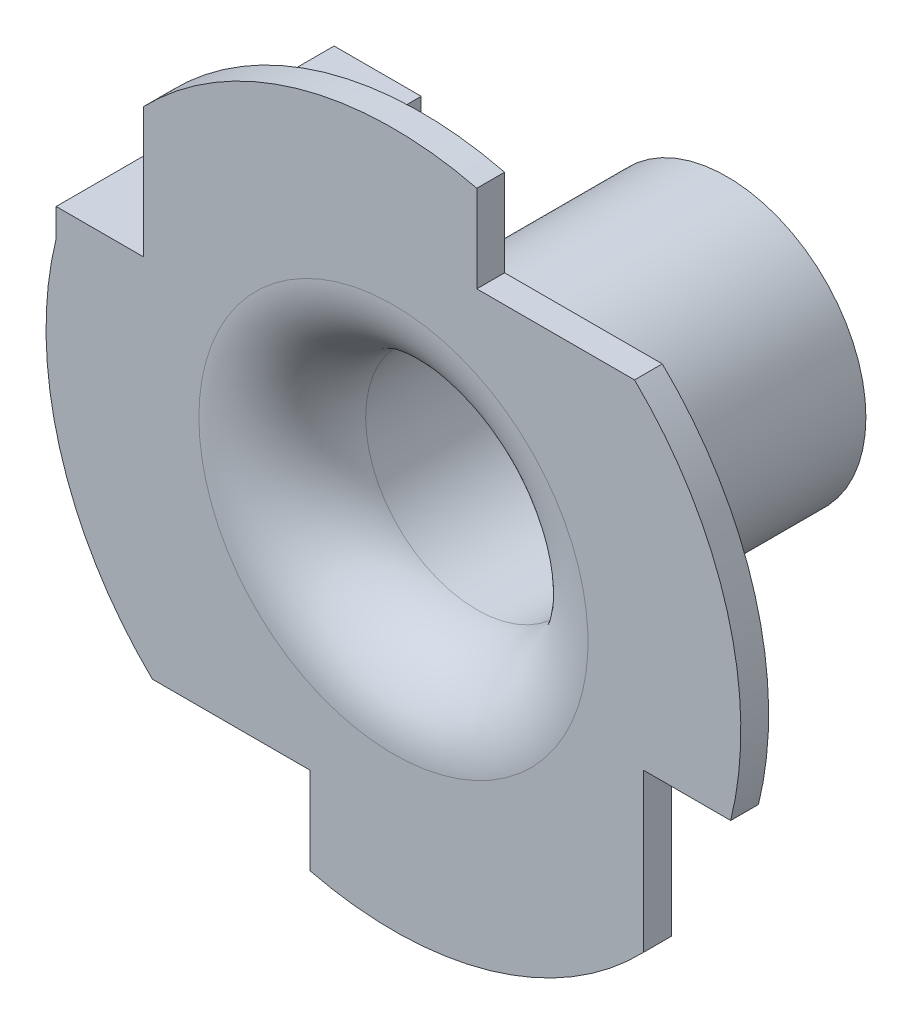
ISO-10303-21;
HEADER;
FILE_DESCRIPTION(('STEP AP214'),'2;1');
FILE_NAME('part.step','',(''),(''),'','','');
FILE_SCHEMA(('AUTOMOTIVE_DESIGN { 1 0 10303 214 1 1 1 1 }'));
ENDSEC;
DATA;
#1=APPLICATION_CONTEXT('core data for automotive mechanical design processes');
#2=APPLICATION_PROTOCOL_DEFINITION('international standard','automotive_design',2000,#1);
#3=PRODUCT_CONTEXT('',#1,'mechanical');
#4=PRODUCT('Part','Part','',(#3));
#5=PRODUCT_RELATED_PRODUCT_CATEGORY('part','',(#4));
#6=PRODUCT_DEFINITION_FORMATION('','',#4);
#7=PRODUCT_DEFINITION_CONTEXT('part definition',#1,'design');
#8=PRODUCT_DEFINITION('design','',#6,#7);
#9=PRODUCT_DEFINITION_SHAPE('','',#8);
#10=(LENGTH_UNIT() NAMED_UNIT(*) SI_UNIT(.MILLI.,.METRE.));
#11=(NAMED_UNIT(*) PLANE_ANGLE_UNIT() SI_UNIT($,.RADIAN.));
#12=(NAMED_UNIT(*) SI_UNIT($,.STERADIAN.) SOLID_ANGLE_UNIT());
#13=UNCERTAINTY_MEASURE_WITH_UNIT(LENGTH_MEASURE(1.E-05),#10,'distance_accuracy_value','');
#14=(GEOMETRIC_REPRESENTATION_CONTEXT(3) GLOBAL_UNCERTAINTY_ASSIGNED_CONTEXT((#13)) GLOBAL_UNIT_ASSIGNED_CONTEXT((#10,
#11,#12)) REPRESENTATION_CONTEXT('',''));
#15=CARTESIAN_POINT('',(0.,0.,0.));
#16=DIRECTION('',(0.,0.,1.));
#17=DIRECTION('',(1.,0.,0.));
#18=AXIS2_PLACEMENT_3D('',#15,#16,#17);
#19=CARTESIAN_POINT('',(-9.,8.67467578644876,10.));
#20=DIRECTION('',(1.,0.,0.));
#21=DIRECTION('',(0.,0.,-1.));
#22=AXIS2_PLACEMENT_3D('',#19,#20,#21);
#23=PLANE('',#22);
#24=DIRECTION('',(0.,0.,-1.));
#25=VECTOR('',#24,1.);
#26=CARTESIAN_POINT('',(-9.,4.,1.));
#27=LINE('',#26,#25);
#28=CARTESIAN_POINT('',(-9.,4.,1.));
#29=VERTEX_POINT('',#28);
#30=CARTESIAN_POINT('',(-9.,4.,0.));
#31=VERTEX_POINT('',#30);
#32=EDGE_CURVE('E71',#29,#31,#27,.T.);
#33=ORIENTED_EDGE('',*,*,#32,.F.);
#34=DIRECTION('',(0.,-1.,0.));
#35=VECTOR('',#34,1.);
#36=CARTESIAN_POINT('',(-9.,0.,1.));
#37=LINE('',#36,#35);
#38=CARTESIAN_POINT('',(-9.,8.67467578644876,0.999999999999999));
#39=VERTEX_POINT('',#38);
#40=EDGE_CURVE('E13',#39,#29,#37,.T.);
#41=ORIENTED_EDGE('',*,*,#40,.F.);
#42=DIRECTION('',(0.,0.,-1.));
#43=VECTOR('',#42,1.);
#44=CARTESIAN_POINT('',(-9.,8.67467578644876,10.));
#45=LINE('',#44,#43);
#46=CARTESIAN_POINT('',(-9.,8.67467578644876,0.));
#47=VERTEX_POINT('',#46);
#48=EDGE_CURVE('E203',#39,#47,#45,.T.);
#49=ORIENTED_EDGE('',*,*,#48,.T.);
#50=DIRECTION('',(0.,-1.,0.));
#51=VECTOR('',#50,1.);
#52=CARTESIAN_POINT('',(-9.,8.67467578644876,0.));
#53=LINE('',#52,#51);
#54=EDGE_CURVE('E196',#47,#31,#53,.T.);
#55=ORIENTED_EDGE('',*,*,#54,.T.);
#56=EDGE_LOOP('',(#33,#41,#49,#55));
#57=FACE_BOUND('',#56,.T.);
#58=ADVANCED_FACE('F51',(#57),#23,.F.);
#59=CARTESIAN_POINT('',(0.,0.,-90.4084027436774));
#60=DIRECTION('',(0.,0.,-1.));
#61=DIRECTION('',(-1.,0.,0.));
#62=AXIS2_PLACEMENT_3D('',#59,#60,#61);
#63=CYLINDRICAL_SURFACE('',#62,12.5);
#64=ORIENTED_EDGE('',*,*,#48,.F.);
#65=CARTESIAN_POINT('',(0.,0.,1.));
#66=DIRECTION('',(0.,0.,-1.));
#67=DIRECTION('',(-1.,0.,0.));
#68=AXIS2_PLACEMENT_3D('',#65,#66,#67);
#69=CIRCLE('',#68,12.5);
#70=CARTESIAN_POINT('',(2.99999999999987,12.1346610995116,0.999999999999999));
#71=VERTEX_POINT('',#70);
#72=EDGE_CURVE('E260',#39,#71,#69,.T.);
#73=ORIENTED_EDGE('',*,*,#72,.T.);
#74=DIRECTION('',(0.,0.,-1.));
#75=VECTOR('',#74,1.);
#76=CARTESIAN_POINT('',(2.99999999999987,12.1346610995116,10.));
#77=LINE('',#76,#75);
#78=CARTESIAN_POINT('',(2.99999999999987,12.1346610995116,0.));
#79=VERTEX_POINT('',#78);
#80=EDGE_CURVE('E193',#71,#79,#77,.T.);
#81=ORIENTED_EDGE('',*,*,#80,.T.);
#82=CARTESIAN_POINT('',(0.,0.,0.));
#83=DIRECTION('',(0.,0.,-1.));
#84=DIRECTION('',(-1.,0.,0.));
#85=AXIS2_PLACEMENT_3D('',#82,#83,#84);
#86=CIRCLE('',#85,12.5);
#87=EDGE_CURVE('E251',#47,#79,#86,.T.);
#88=ORIENTED_EDGE('',*,*,#87,.F.);
#89=EDGE_LOOP('',(#64,#73,#81,#88));
#90=FACE_BOUND('',#89,.T.);
#91=ADVANCED_FACE('F303',(#90),#63,.T.);
#92=CARTESIAN_POINT('',(-8.67467578644872,-9.00000000000003,0.999999999999999));
#93=VERTEX_POINT('',#92);
#94=CARTESIAN_POINT('',(-12.1346610995116,3.,0.999999999999999));
#95=VERTEX_POINT('',#94);
#96=EDGE_CURVE('E255',#93,#95,#69,.T.);
#97=ORIENTED_EDGE('',*,*,#96,.T.);
#98=DIRECTION('',(0.,0.,-1.));
#99=VECTOR('',#98,1.);
#100=CARTESIAN_POINT('',(-12.1346610995116,3.,10.));
#101=LINE('',#100,#99);
#102=CARTESIAN_POINT('',(-12.1346610995116,3.,0.));
#103=VERTEX_POINT('',#102);
#104=EDGE_CURVE('E205',#95,#103,#101,.T.);
#105=ORIENTED_EDGE('',*,*,#104,.T.);
#106=CARTESIAN_POINT('',(-8.67467578644872,-9.00000000000003,0.));
#107=VERTEX_POINT('',#106);
#108=EDGE_CURVE('E248',#107,#103,#86,.T.);
#109=ORIENTED_EDGE('',*,*,#108,.F.);
#110=DIRECTION('',(0.,0.,-1.));
#111=VECTOR('',#110,1.);
#112=CARTESIAN_POINT('',(-8.67467578644872,-9.00000000000003,10.));
#113=LINE('',#112,#111);
#114=EDGE_CURVE('E206',#93,#107,#113,.T.);
#115=ORIENTED_EDGE('',*,*,#114,.F.);
#116=EDGE_LOOP('',(#97,#105,#109,#115));
#117=FACE_BOUND('',#116,.T.);
#118=ADVANCED_FACE('F342',(#117),#63,.T.);
#119=CARTESIAN_POINT('',(9.00000000000006,-8.67467578644869,0.999999999999999));
#120=VERTEX_POINT('',#119);
#121=CARTESIAN_POINT('',(-2.99999999999996,-12.1346610995116,0.999999999999999));
#122=VERTEX_POINT('',#121);
#123=EDGE_CURVE('E258',#120,#122,#69,.T.);
#124=ORIENTED_EDGE('',*,*,#123,.T.);
#125=DIRECTION('',(0.,0.,-1.));
#126=VECTOR('',#125,1.);
#127=CARTESIAN_POINT('',(-2.99999999999996,-12.1346610995116,10.));
#128=LINE('',#127,#126);
#129=CARTESIAN_POINT('',(-2.99999999999996,-12.1346610995116,0.));
#130=VERTEX_POINT('',#129);
#131=EDGE_CURVE('E211',#122,#130,#128,.T.);
#132=ORIENTED_EDGE('',*,*,#131,.T.);
#133=CARTESIAN_POINT('',(9.00000000000006,-8.67467578644869,0.));
#134=VERTEX_POINT('',#133);
#135=EDGE_CURVE('E252',#134,#130,#86,.T.);
#136=ORIENTED_EDGE('',*,*,#135,.F.);
#137=DIRECTION('',(0.,0.,-1.));
#138=VECTOR('',#137,1.);
#139=CARTESIAN_POINT('',(9.00000000000006,-8.67467578644869,10.));
#140=LINE('',#139,#138);
#141=EDGE_CURVE('E218',#120,#134,#140,.T.);
#142=ORIENTED_EDGE('',*,*,#141,.F.);
#143=EDGE_LOOP('',(#124,#132,#136,#142));
#144=FACE_BOUND('',#143,.T.);
#145=ADVANCED_FACE('F295',(#144),#63,.T.);
#146=CARTESIAN_POINT('',(7.00000000000001,0.,0.));
#147=DIRECTION('',(0.,0.,1.));
#148=DIRECTION('',(1.,0.,0.));
#149=AXIS2_PLACEMENT_3D('',#146,#147,#148);
#150=PLANE('',#149);
#151=CARTESIAN_POINT('',(0.,0.,0.));
#152=DIRECTION('',(0.,0.,-1.));
#153=DIRECTION('',(-1.,0.,0.));
#154=AXIS2_PLACEMENT_3D('',#151,#152,#153);
#155=CIRCLE('',#154,7.00000000000001);
#156=CARTESIAN_POINT('',(-7.00000000000001,0.,0.));
#157=VERTEX_POINT('',#156);
#158=EDGE_CURVE('E249',#157,#157,#155,.T.);
#159=ORIENTED_EDGE('',*,*,#158,.F.);
#160=EDGE_LOOP('',(#159));
#161=FACE_BOUND('',#160,.T.);
#162=ORIENTED_EDGE('',*,*,#54,.F.);
#163=ORIENTED_EDGE('',*,*,#87,.T.);
#164=DIRECTION('',(0.,1.,0.));
#165=VECTOR('',#164,1.);
#166=CARTESIAN_POINT('',(2.99999999999991,9.00000000000003,0.));
#167=LINE('',#166,#165);
#168=CARTESIAN_POINT('',(2.99999999999991,9.00000000000003,0.));
#169=VERTEX_POINT('',#168);
#170=EDGE_CURVE('E235',#169,#79,#167,.T.);
#171=ORIENTED_EDGE('',*,*,#170,.F.);
#172=DIRECTION('',(-1.,0.,0.));
#173=VECTOR('',#172,1.);
#174=CARTESIAN_POINT('',(8.67467578644866,9.00000000000009,0.));
#175=LINE('',#174,#173);
#176=CARTESIAN_POINT('',(8.67467578644866,9.00000000000009,0.));
#177=VERTEX_POINT('',#176);
#178=EDGE_CURVE('E230',#177,#169,#175,.T.);
#179=ORIENTED_EDGE('',*,*,#178,.F.);
#180=CARTESIAN_POINT('',(12.1346610995116,-2.99999999999991,0.));
#181=VERTEX_POINT('',#180);
#182=EDGE_CURVE('E316',#177,#181,#86,.T.);
#183=ORIENTED_EDGE('',*,*,#182,.T.);
#184=DIRECTION('',(1.,0.,0.));
#185=VECTOR('',#184,1.);
#186=CARTESIAN_POINT('',(9.00000000000002,-2.99999999999994,0.));
#187=LINE('',#186,#185);
#188=CARTESIAN_POINT('',(9.00000000000002,-2.99999999999994,0.));
#189=VERTEX_POINT('',#188);
#190=EDGE_CURVE('E222',#189,#181,#187,.T.);
#191=ORIENTED_EDGE('',*,*,#190,.F.);
#192=DIRECTION('',(0.,1.,0.));
#193=VECTOR('',#192,1.);
#194=CARTESIAN_POINT('',(9.00000000000006,-8.67467578644869,0.));
#195=LINE('',#194,#193);
#196=EDGE_CURVE('E212',#134,#189,#195,.T.);
#197=ORIENTED_EDGE('',*,*,#196,.F.);
#198=ORIENTED_EDGE('',*,*,#135,.T.);
#199=DIRECTION('',(0.,-1.,0.));
#200=VECTOR('',#199,1.);
#201=CARTESIAN_POINT('',(-2.99999999999997,-9.00000000000001,0.));
#202=LINE('',#201,#200);
#203=CARTESIAN_POINT('',(-2.99999999999997,-9.00000000000001,0.));
#204=VERTEX_POINT('',#203);
#205=EDGE_CURVE('E208',#204,#130,#202,.T.);
#206=ORIENTED_EDGE('',*,*,#205,.F.);
#207=DIRECTION('',(1.,0.,0.));
#208=VECTOR('',#207,1.);
#209=CARTESIAN_POINT('',(-8.67467578644872,-9.00000000000003,0.));
#210=LINE('',#209,#208);
#211=EDGE_CURVE('E216',#107,#204,#210,.T.);
#212=ORIENTED_EDGE('',*,*,#211,.F.);
#213=ORIENTED_EDGE('',*,*,#108,.T.);
#214=DIRECTION('',(-1.,0.,0.));
#215=VECTOR('',#214,1.);
#216=CARTESIAN_POINT('',(-9.,3.,0.));
#217=LINE('',#216,#215);
#218=CARTESIAN_POINT('',(-9.,3.,0.));
#219=VERTEX_POINT('',#218);
#220=EDGE_CURVE('E167',#219,#103,#217,.T.);
#221=ORIENTED_EDGE('',*,*,#220,.F.);
#222=EDGE_CURVE('E69',#31,#219,#53,.T.);
#223=ORIENTED_EDGE('',*,*,#222,.F.);
#224=EDGE_LOOP('',(#162,#163,#171,#179,#183,#191,#197,#198,#206,#212,#213,#221,#223));
#225=FACE_BOUND('',#224,.T.);
#226=ADVANCED_FACE('F311',(#161,#225),#150,.F.);
#227=CARTESIAN_POINT('',(4.00000000000001,0.,-11.));
#228=DIRECTION('',(0.,0.,1.));
#229=DIRECTION('',(1.,0.,0.));
#230=AXIS2_PLACEMENT_3D('',#227,#228,#229);
#231=PLANE('',#230);
#232=CARTESIAN_POINT('',(0.,0.,-11.));
#233=DIRECTION('',(0.,0.,-1.));
#234=DIRECTION('',(-1.,0.,0.));
#235=AXIS2_PLACEMENT_3D('',#232,#233,#234);
#236=CIRCLE('',#235,4.00000000000001);
#237=CARTESIAN_POINT('',(-4.00000000000001,0.,-11.));
#238=VERTEX_POINT('',#237);
#239=EDGE_CURVE('E262',#238,#238,#236,.T.);
#240=ORIENTED_EDGE('',*,*,#239,.F.);
#241=EDGE_LOOP('',(#240));
#242=FACE_BOUND('',#241,.T.);
#243=CARTESIAN_POINT('',(0.,0.,-11.));
#244=DIRECTION('',(0.,0.,-1.));
#245=DIRECTION('',(-1.,0.,0.));
#246=AXIS2_PLACEMENT_3D('',#243,#244,#245);
#247=CIRCLE('',#246,5.00000000000001);
#248=CARTESIAN_POINT('',(-5.00000000000001,0.,-11.));
#249=VERTEX_POINT('',#248);
#250=EDGE_CURVE('E204',#249,#249,#247,.T.);
#251=ORIENTED_EDGE('',*,*,#250,.T.);
#252=EDGE_LOOP('',(#251));
#253=FACE_BOUND('',#252,.T.);
#254=ADVANCED_FACE('F52',(#242,#253),#231,.F.);
#255=CARTESIAN_POINT('',(0.,0.,-90.4084027436774));
#256=DIRECTION('',(0.,0.,-1.));
#257=DIRECTION('',(-1.,0.,0.));
#258=AXIS2_PLACEMENT_3D('',#255,#256,#257);
#259=CYLINDRICAL_SURFACE('',#258,4.00000000000001);
#260=CARTESIAN_POINT('',(0.,0.,-2.));
#261=DIRECTION('',(0.,0.,-1.));
#262=DIRECTION('',(-1.,0.,0.));
#263=AXIS2_PLACEMENT_3D('',#260,#261,#262);
#264=CIRCLE('',#263,4.00000000000001);
#265=CARTESIAN_POINT('',(-4.00000000000001,0.,-2.));
#266=VERTEX_POINT('',#265);
#267=EDGE_CURVE('E261',#266,#266,#264,.T.);
#268=ORIENTED_EDGE('',*,*,#267,.F.);
#269=EDGE_LOOP('',(#268));
#270=FACE_BOUND('',#269,.T.);
#271=ORIENTED_EDGE('',*,*,#239,.T.);
#272=EDGE_LOOP('',(#271));
#273=FACE_BOUND('',#272,.T.);
#274=ADVANCED_FACE('F446',(#270,#273),#259,.F.);
#275=CARTESIAN_POINT('',(0.,0.,-2.));
#276=DIRECTION('',(0.,0.,-1.));
#277=DIRECTION('',(-1.,0.,0.));
#278=AXIS2_PLACEMENT_3D('',#275,#276,#277);
#279=TOROIDAL_SURFACE('',#278,7.00000000000001,3.);
#280=CARTESIAN_POINT('',(0.,0.,1.));
#281=DIRECTION('',(0.,0.,-1.));
#282=DIRECTION('',(-1.,0.,0.));
#283=AXIS2_PLACEMENT_3D('',#280,#281,#282);
#284=CIRCLE('',#283,7.00000000000001);
#285=CARTESIAN_POINT('',(-7.00000000000001,0.,1.));
#286=VERTEX_POINT('',#285);
#287=EDGE_CURVE('E256',#286,#286,#284,.T.);
#288=ORIENTED_EDGE('',*,*,#287,.F.);
#289=EDGE_LOOP('',(#288));
#290=FACE_BOUND('',#289,.T.);
#291=ORIENTED_EDGE('',*,*,#267,.T.);
#292=EDGE_LOOP('',(#291));
#293=FACE_BOUND('',#292,.T.);
#294=ADVANCED_FACE('F387',(#290,#293),#279,.T.);
#295=CARTESIAN_POINT('',(7.00000000000001,0.,1.));
#296=DIRECTION('',(0.,0.,-1.));
#297=DIRECTION('',(-1.,0.,0.));
#298=AXIS2_PLACEMENT_3D('',#295,#296,#297);
#299=PLANE('',#298);
#300=ORIENTED_EDGE('',*,*,#40,.T.);
#301=DIRECTION('',(-1.,0.,0.));
#302=VECTOR('',#301,1.);
#303=CARTESIAN_POINT('',(-9.,4.,1.));
#304=LINE('',#303,#302);
#305=CARTESIAN_POINT('',(-12.1346610995116,4.,1.));
#306=VERTEX_POINT('',#305);
#307=EDGE_CURVE('E168',#29,#306,#304,.T.);
#308=ORIENTED_EDGE('',*,*,#307,.T.);
#309=DIRECTION('',(0.,1.,0.));
#310=VECTOR('',#309,1.);
#311=CARTESIAN_POINT('',(-12.1346610995116,3.,1.));
#312=LINE('',#311,#310);
#313=EDGE_CURVE('E186',#95,#306,#312,.T.);
#314=ORIENTED_EDGE('',*,*,#313,.F.);
#315=ORIENTED_EDGE('',*,*,#96,.F.);
#316=DIRECTION('',(1.,0.,0.));
#317=VECTOR('',#316,1.);
#318=CARTESIAN_POINT('',(7.00000000000004,-8.99999999999998,1.));
#319=LINE('',#318,#317);
#320=CARTESIAN_POINT('',(-2.99999999999997,-9.00000000000001,1.));
#321=VERTEX_POINT('',#320);
#322=EDGE_CURVE('E276',#93,#321,#319,.T.);
#323=ORIENTED_EDGE('',*,*,#322,.T.);
#324=DIRECTION('',(0.,-1.,0.));
#325=VECTOR('',#324,1.);
#326=CARTESIAN_POINT('',(-3.,0.,1.));
#327=LINE('',#326,#325);
#328=EDGE_CURVE('E56',#321,#122,#327,.T.);
#329=ORIENTED_EDGE('',*,*,#328,.T.);
#330=ORIENTED_EDGE('',*,*,#123,.F.);
#331=DIRECTION('',(0.,1.,0.));
#332=VECTOR('',#331,1.);
#333=CARTESIAN_POINT('',(9.,0.,1.));
#334=LINE('',#333,#332);
#335=CARTESIAN_POINT('',(9.00000000000002,-2.99999999999994,1.));
#336=VERTEX_POINT('',#335);
#337=EDGE_CURVE('E272',#120,#336,#334,.T.);
#338=ORIENTED_EDGE('',*,*,#337,.T.);
#339=DIRECTION('',(1.,0.,0.));
#340=VECTOR('',#339,1.);
#341=CARTESIAN_POINT('',(7.00000000000003,-2.99999999999995,1.));
#342=LINE('',#341,#340);
#343=CARTESIAN_POINT('',(12.1346610995116,-2.99999999999991,0.999999999999999));
#344=VERTEX_POINT('',#343);
#345=EDGE_CURVE('E277',#336,#344,#342,.T.);
#346=ORIENTED_EDGE('',*,*,#345,.T.);
#347=CARTESIAN_POINT('',(8.67467578644866,9.00000000000009,0.999999999999999));
#348=VERTEX_POINT('',#347);
#349=EDGE_CURVE('E293',#348,#344,#69,.T.);
#350=ORIENTED_EDGE('',*,*,#349,.F.);
#351=DIRECTION('',(-1.,0.,0.));
#352=VECTOR('',#351,1.);
#353=CARTESIAN_POINT('',(6.99999999999992,9.00000000000007,1.));
#354=LINE('',#353,#352);
#355=CARTESIAN_POINT('',(2.99999999999991,9.00000000000003,1.));
#356=VERTEX_POINT('',#355);
#357=EDGE_CURVE('E270',#348,#356,#354,.T.);
#358=ORIENTED_EDGE('',*,*,#357,.T.);
#359=DIRECTION('',(0.,1.,0.));
#360=VECTOR('',#359,1.);
#361=CARTESIAN_POINT('',(3.,0.,1.));
#362=LINE('',#361,#360);
#363=EDGE_CURVE('E269',#356,#71,#362,.T.);
#364=ORIENTED_EDGE('',*,*,#363,.T.);
#365=ORIENTED_EDGE('',*,*,#72,.F.);
#366=EDGE_LOOP('',(#300,#308,#314,#315,#323,#329,#330,#338,#346,#350,#358,#364,#365));
#367=FACE_BOUND('',#366,.T.);
#368=ORIENTED_EDGE('',*,*,#287,.T.);
#369=EDGE_LOOP('',(#368));
#370=FACE_BOUND('',#369,.T.);
#371=ADVANCED_FACE('F289',(#367,#370),#299,.F.);
#372=ORIENTED_EDGE('',*,*,#349,.T.);
#373=DIRECTION('',(0.,0.,-1.));
#374=VECTOR('',#373,1.);
#375=CARTESIAN_POINT('',(12.1346610995116,-2.99999999999991,10.));
#376=LINE('',#375,#374);
#377=EDGE_CURVE('E221',#344,#181,#376,.T.);
#378=ORIENTED_EDGE('',*,*,#377,.T.);
#379=ORIENTED_EDGE('',*,*,#182,.F.);
#380=DIRECTION('',(0.,0.,-1.));
#381=VECTOR('',#380,1.);
#382=CARTESIAN_POINT('',(8.67467578644866,9.00000000000009,10.));
#383=LINE('',#382,#381);
#384=EDGE_CURVE('E234',#348,#177,#383,.T.);
#385=ORIENTED_EDGE('',*,*,#384,.F.);
#386=EDGE_LOOP('',(#372,#378,#379,#385));
#387=FACE_BOUND('',#386,.T.);
#388=ADVANCED_FACE('F326',(#387),#63,.T.);
#389=CARTESIAN_POINT('',(0.,0.,-2.));
#390=DIRECTION('',(0.,0.,-1.));
#391=DIRECTION('',(-1.,0.,0.));
#392=AXIS2_PLACEMENT_3D('',#389,#390,#391);
#393=TOROIDAL_SURFACE('',#392,7.00000000000001,2.);
#394=CARTESIAN_POINT('',(0.,0.,-2.));
#395=DIRECTION('',(0.,0.,-1.));
#396=DIRECTION('',(-1.,0.,0.));
#397=AXIS2_PLACEMENT_3D('',#394,#395,#396);
#398=CIRCLE('',#397,5.00000000000001);
#399=CARTESIAN_POINT('',(-5.00000000000001,0.,-2.));
#400=VERTEX_POINT('',#399);
#401=EDGE_CURVE('E244',#400,#400,#398,.T.);
#402=ORIENTED_EDGE('',*,*,#401,.F.);
#403=EDGE_LOOP('',(#402));
#404=FACE_BOUND('',#403,.T.);
#405=ORIENTED_EDGE('',*,*,#158,.T.);
#406=EDGE_LOOP('',(#405));
#407=FACE_BOUND('',#406,.T.);
#408=ADVANCED_FACE('F443',(#404,#407),#393,.F.);
#409=CARTESIAN_POINT('',(0.,0.,-90.4084027436774));
#410=DIRECTION('',(0.,0.,-1.));
#411=DIRECTION('',(-1.,0.,0.));
#412=AXIS2_PLACEMENT_3D('',#409,#410,#411);
#413=CYLINDRICAL_SURFACE('',#412,5.00000000000001);
#414=ORIENTED_EDGE('',*,*,#250,.F.);
#415=EDGE_LOOP('',(#414));
#416=FACE_BOUND('',#415,.T.);
#417=ORIENTED_EDGE('',*,*,#401,.T.);
#418=EDGE_LOOP('',(#417));
#419=FACE_BOUND('',#418,.T.);
#420=ADVANCED_FACE('F337',(#416,#419),#413,.T.);
#421=CARTESIAN_POINT('',(2.99999999999991,9.00000000000003,10.));
#422=DIRECTION('',(-1.,0.,0.));
#423=DIRECTION('',(0.,-1.,0.));
#424=AXIS2_PLACEMENT_3D('',#421,#422,#423);
#425=PLANE('',#424);
#426=DIRECTION('',(0.,0.,-1.));
#427=VECTOR('',#426,1.);
#428=CARTESIAN_POINT('',(2.99999999999991,9.00000000000003,10.));
#429=LINE('',#428,#427);
#430=EDGE_CURVE('E233',#356,#169,#429,.T.);
#431=ORIENTED_EDGE('',*,*,#430,.T.);
#432=ORIENTED_EDGE('',*,*,#170,.T.);
#433=ORIENTED_EDGE('',*,*,#80,.F.);
#434=ORIENTED_EDGE('',*,*,#363,.F.);
#435=EDGE_LOOP('',(#431,#432,#433,#434));
#436=FACE_BOUND('',#435,.T.);
#437=ADVANCED_FACE('F309',(#436),#425,.F.);
#438=CARTESIAN_POINT('',(8.67467578644866,9.00000000000009,10.));
#439=DIRECTION('',(0.,-1.,0.));
#440=DIRECTION('',(1.,0.,0.));
#441=AXIS2_PLACEMENT_3D('',#438,#439,#440);
#442=PLANE('',#441);
#443=ORIENTED_EDGE('',*,*,#384,.T.);
#444=ORIENTED_EDGE('',*,*,#178,.T.);
#445=ORIENTED_EDGE('',*,*,#430,.F.);
#446=ORIENTED_EDGE('',*,*,#357,.F.);
#447=EDGE_LOOP('',(#443,#444,#445,#446));
#448=FACE_BOUND('',#447,.T.);
#449=ADVANCED_FACE('F327',(#448),#442,.F.);
#450=CARTESIAN_POINT('',(9.00000000000002,-2.99999999999994,10.));
#451=DIRECTION('',(0.,1.,0.));
#452=DIRECTION('',(-1.,0.,0.));
#453=AXIS2_PLACEMENT_3D('',#450,#451,#452);
#454=PLANE('',#453);
#455=DIRECTION('',(0.,0.,-1.));
#456=VECTOR('',#455,1.);
#457=CARTESIAN_POINT('',(9.00000000000002,-2.99999999999994,10.));
#458=LINE('',#457,#456);
#459=EDGE_CURVE('E225',#336,#189,#458,.T.);
#460=ORIENTED_EDGE('',*,*,#459,.T.);
#461=ORIENTED_EDGE('',*,*,#190,.T.);
#462=ORIENTED_EDGE('',*,*,#377,.F.);
#463=ORIENTED_EDGE('',*,*,#345,.F.);
#464=EDGE_LOOP('',(#460,#461,#462,#463));
#465=FACE_BOUND('',#464,.T.);
#466=ADVANCED_FACE('F324',(#465),#454,.F.);
#467=CARTESIAN_POINT('',(9.00000000000006,-8.67467578644869,10.));
#468=DIRECTION('',(-1.,0.,0.));
#469=DIRECTION('',(0.,-1.,0.));
#470=AXIS2_PLACEMENT_3D('',#467,#468,#469);
#471=PLANE('',#470);
#472=ORIENTED_EDGE('',*,*,#141,.T.);
#473=ORIENTED_EDGE('',*,*,#196,.T.);
#474=ORIENTED_EDGE('',*,*,#459,.F.);
#475=ORIENTED_EDGE('',*,*,#337,.F.);
#476=EDGE_LOOP('',(#472,#473,#474,#475));
#477=FACE_BOUND('',#476,.T.);
#478=ADVANCED_FACE('F325',(#477),#471,.F.);
#479=CARTESIAN_POINT('',(-2.99999999999997,-9.00000000000001,10.));
#480=DIRECTION('',(1.,0.,0.));
#481=DIRECTION('',(0.,1.,0.));
#482=AXIS2_PLACEMENT_3D('',#479,#480,#481);
#483=PLANE('',#482);
#484=DIRECTION('',(0.,0.,-1.));
#485=VECTOR('',#484,1.);
#486=CARTESIAN_POINT('',(-2.99999999999997,-9.00000000000001,10.));
#487=LINE('',#486,#485);
#488=EDGE_CURVE('E207',#321,#204,#487,.T.);
#489=ORIENTED_EDGE('',*,*,#488,.T.);
#490=ORIENTED_EDGE('',*,*,#205,.T.);
#491=ORIENTED_EDGE('',*,*,#131,.F.);
#492=ORIENTED_EDGE('',*,*,#328,.F.);
#493=EDGE_LOOP('',(#489,#490,#491,#492));
#494=FACE_BOUND('',#493,.T.);
#495=ADVANCED_FACE('F355',(#494),#483,.F.);
#496=CARTESIAN_POINT('',(-8.67467578644872,-9.00000000000003,10.));
#497=DIRECTION('',(0.,1.,0.));
#498=DIRECTION('',(-1.,0.,0.));
#499=AXIS2_PLACEMENT_3D('',#496,#497,#498);
#500=PLANE('',#499);
#501=ORIENTED_EDGE('',*,*,#114,.T.);
#502=ORIENTED_EDGE('',*,*,#211,.T.);
#503=ORIENTED_EDGE('',*,*,#488,.F.);
#504=ORIENTED_EDGE('',*,*,#322,.F.);
#505=EDGE_LOOP('',(#501,#502,#503,#504));
#506=FACE_BOUND('',#505,.T.);
#507=ADVANCED_FACE('F348',(#506),#500,.F.);
#508=CARTESIAN_POINT('',(-9.,3.,1.));
#509=DIRECTION('',(0.,-1.,0.));
#510=DIRECTION('',(0.,0.,-1.));
#511=AXIS2_PLACEMENT_3D('',#508,#509,#510);
#512=PLANE('',#511);
#513=ORIENTED_EDGE('',*,*,#220,.T.);
#514=DIRECTION('',(0.,0.,-1.));
#515=VECTOR('',#514,1.);
#516=CARTESIAN_POINT('',(-12.1346610995116,3.,1.));
#517=LINE('',#516,#515);
#518=CARTESIAN_POINT('',(-12.1346610995116,3.,-9.));
#519=VERTEX_POINT('',#518);
#520=EDGE_CURVE('E157',#103,#519,#517,.T.);
#521=ORIENTED_EDGE('',*,*,#520,.T.);
#522=DIRECTION('',(-1.,0.,0.));
#523=VECTOR('',#522,1.);
#524=CARTESIAN_POINT('',(-9.,3.,-9.));
#525=LINE('',#524,#523);
#526=CARTESIAN_POINT('',(-9.,3.,-9.));
#527=VERTEX_POINT('',#526);
#528=EDGE_CURVE('E163',#527,#519,#525,.T.);
#529=ORIENTED_EDGE('',*,*,#528,.F.);
#530=DIRECTION('',(0.,0.,-1.));
#531=VECTOR('',#530,1.);
#532=CARTESIAN_POINT('',(-9.,3.,1.));
#533=LINE('',#532,#531);
#534=EDGE_CURVE('E191',#219,#527,#533,.T.);
#535=ORIENTED_EDGE('',*,*,#534,.F.);
#536=EDGE_LOOP('',(#513,#521,#529,#535));
#537=FACE_BOUND('',#536,.T.);
#538=ADVANCED_FACE('F161',(#537),#512,.T.);
#539=CARTESIAN_POINT('',(-9.,3.,1.));
#540=DIRECTION('',(-1.,0.,0.));
#541=DIRECTION('',(0.,0.,1.));
#542=AXIS2_PLACEMENT_3D('',#539,#540,#541);
#543=PLANE('',#542);
#544=CARTESIAN_POINT('',(-9.,4.,-9.));
#545=VERTEX_POINT('',#544);
#546=EDGE_CURVE('E198',#31,#545,#27,.T.);
#547=ORIENTED_EDGE('',*,*,#546,.F.);
#548=ORIENTED_EDGE('',*,*,#222,.T.);
#549=ORIENTED_EDGE('',*,*,#534,.T.);
#550=DIRECTION('',(0.,1.,0.));
#551=VECTOR('',#550,1.);
#552=CARTESIAN_POINT('',(-9.,3.,-9.));
#553=LINE('',#552,#551);
#554=EDGE_CURVE('E184',#527,#545,#553,.T.);
#555=ORIENTED_EDGE('',*,*,#554,.T.);
#556=EDGE_LOOP('',(#547,#548,#549,#555));
#557=FACE_BOUND('',#556,.T.);
#558=ADVANCED_FACE('F398',(#557),#543,.F.);
#559=CARTESIAN_POINT('',(-9.,4.,1.));
#560=DIRECTION('',(0.,-1.,0.));
#561=DIRECTION('',(0.,0.,-1.));
#562=AXIS2_PLACEMENT_3D('',#559,#560,#561);
#563=PLANE('',#562);
#564=ORIENTED_EDGE('',*,*,#32,.T.);
#565=ORIENTED_EDGE('',*,*,#546,.T.);
#566=DIRECTION('',(-1.,0.,0.));
#567=VECTOR('',#566,1.);
#568=CARTESIAN_POINT('',(-9.,4.,-9.));
#569=LINE('',#568,#567);
#570=CARTESIAN_POINT('',(-12.1346610995116,4.,-9.));
#571=VERTEX_POINT('',#570);
#572=EDGE_CURVE('E177',#545,#571,#569,.T.);
#573=ORIENTED_EDGE('',*,*,#572,.T.);
#574=DIRECTION('',(0.,0.,-1.));
#575=VECTOR('',#574,1.);
#576=CARTESIAN_POINT('',(-12.1346610995116,4.,1.));
#577=LINE('',#576,#575);
#578=EDGE_CURVE('E166',#306,#571,#577,.T.);
#579=ORIENTED_EDGE('',*,*,#578,.F.);
#580=ORIENTED_EDGE('',*,*,#307,.F.);
#581=EDGE_LOOP('',(#564,#565,#573,#579,#580));
#582=FACE_BOUND('',#581,.T.);
#583=ADVANCED_FACE('F410',(#582),#563,.F.);
#584=CARTESIAN_POINT('',(-12.1346610995116,3.,1.));
#585=DIRECTION('',(-1.,0.,0.));
#586=DIRECTION('',(0.,0.,1.));
#587=AXIS2_PLACEMENT_3D('',#584,#585,#586);
#588=PLANE('',#587);
#589=ORIENTED_EDGE('',*,*,#578,.T.);
#590=DIRECTION('',(0.,1.,0.));
#591=VECTOR('',#590,1.);
#592=CARTESIAN_POINT('',(-12.1346610995116,3.,-9.));
#593=LINE('',#592,#591);
#594=EDGE_CURVE('E174',#519,#571,#593,.T.);
#595=ORIENTED_EDGE('',*,*,#594,.F.);
#596=ORIENTED_EDGE('',*,*,#520,.F.);
#597=ORIENTED_EDGE('',*,*,#104,.F.);
#598=ORIENTED_EDGE('',*,*,#313,.T.);
#599=EDGE_LOOP('',(#589,#595,#596,#597,#598));
#600=FACE_BOUND('',#599,.T.);
#601=ADVANCED_FACE('F171',(#600),#588,.T.);
#602=CARTESIAN_POINT('',(0.,0.,-9.));
#603=DIRECTION('',(0.,0.,-1.));
#604=DIRECTION('',(-1.,0.,0.));
#605=AXIS2_PLACEMENT_3D('',#602,#603,#604);
#606=PLANE('',#605);
#607=ORIENTED_EDGE('',*,*,#528,.T.);
#608=ORIENTED_EDGE('',*,*,#594,.T.);
#609=ORIENTED_EDGE('',*,*,#572,.F.);
#610=ORIENTED_EDGE('',*,*,#554,.F.);
#611=EDGE_LOOP('',(#607,#608,#609,#610));
#612=FACE_BOUND('',#611,.T.);
#613=ADVANCED_FACE('F185',(#612),#606,.T.);
#614=CLOSED_SHELL('',(#58,#91,#118,#145,#226,#254,#274,#294,#371,#388,#408,#420,#437,#449,#466,
#478,#495,#507,#538,#558,#583,#601,#613));
#615=MANIFOLD_SOLID_BREP('B2',#614);
#616=ADVANCED_BREP_SHAPE_REPRESENTATION('',(#18,#615),#14);
#617=SHAPE_DEFINITION_REPRESENTATION(#9,#616);
ENDSEC;
END-ISO-10303-21;
